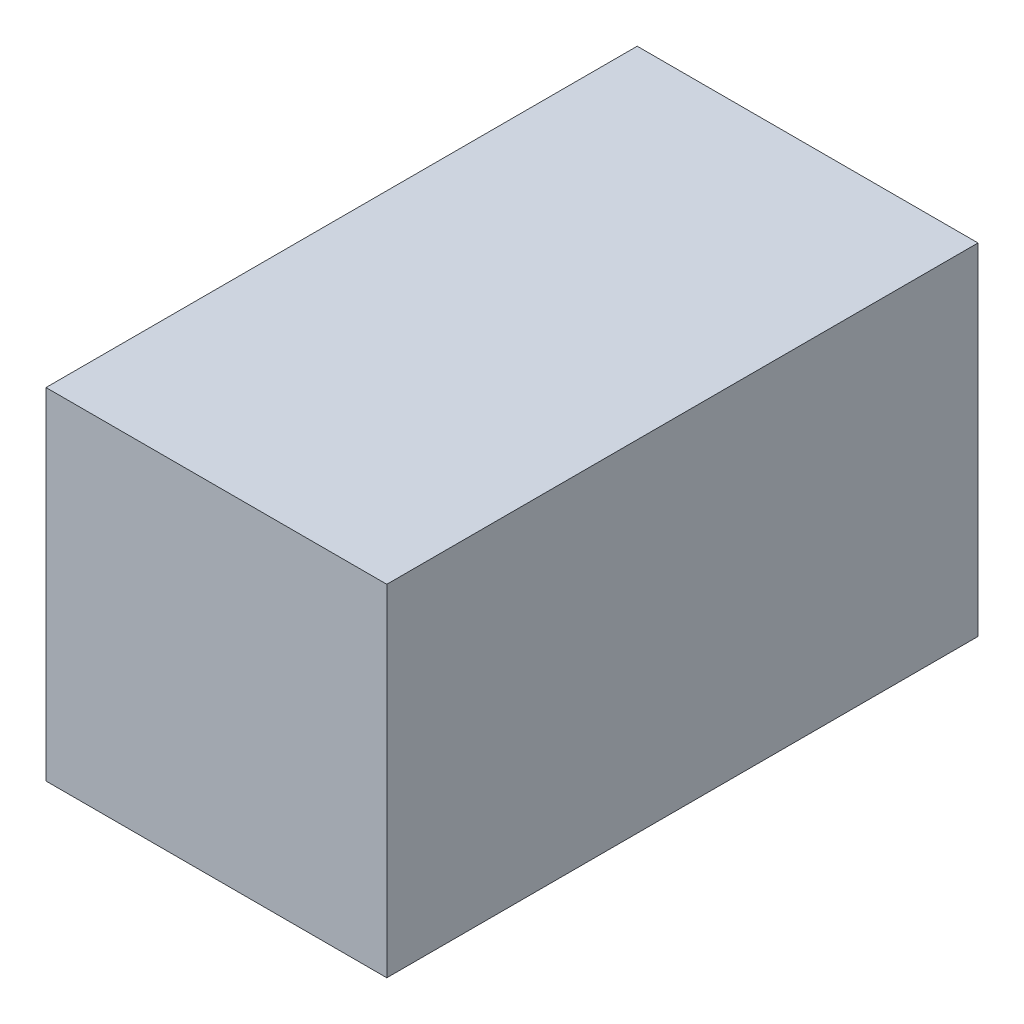
ISO-10303-21;
HEADER;
FILE_DESCRIPTION(('STEP AP214'),'2;1');
FILE_NAME('part.step','',(''),(''),'','','');
FILE_SCHEMA(('AUTOMOTIVE_DESIGN { 1 0 10303 214 1 1 1 1 }'));
ENDSEC;
DATA;
#1=APPLICATION_CONTEXT('core data for automotive mechanical design processes');
#2=APPLICATION_PROTOCOL_DEFINITION('international standard','automotive_design',2000,#1);
#3=PRODUCT_CONTEXT('',#1,'mechanical');
#4=PRODUCT('Part','Part','',(#3));
#5=PRODUCT_RELATED_PRODUCT_CATEGORY('part','',(#4));
#6=PRODUCT_DEFINITION_FORMATION('','',#4);
#7=PRODUCT_DEFINITION_CONTEXT('part definition',#1,'design');
#8=PRODUCT_DEFINITION('design','',#6,#7);
#9=PRODUCT_DEFINITION_SHAPE('','',#8);
#10=(LENGTH_UNIT() NAMED_UNIT(*) SI_UNIT(.MILLI.,.METRE.));
#11=(NAMED_UNIT(*) PLANE_ANGLE_UNIT() SI_UNIT($,.RADIAN.));
#12=(NAMED_UNIT(*) SI_UNIT($,.STERADIAN.) SOLID_ANGLE_UNIT());
#13=UNCERTAINTY_MEASURE_WITH_UNIT(LENGTH_MEASURE(1.E-05),#10,'distance_accuracy_value','');
#14=(GEOMETRIC_REPRESENTATION_CONTEXT(3) GLOBAL_UNCERTAINTY_ASSIGNED_CONTEXT((#13)) GLOBAL_UNIT_ASSIGNED_CONTEXT((#10,
#11,#12)) REPRESENTATION_CONTEXT('',''));
#15=CARTESIAN_POINT('',(0.,0.,0.));
#16=DIRECTION('',(0.,0.,1.));
#17=DIRECTION('',(1.,0.,0.));
#18=AXIS2_PLACEMENT_3D('',#15,#16,#17);
#19=CARTESIAN_POINT('',(-12.25,0.,0.));
#20=DIRECTION('',(0.,0.,1.));
#21=DIRECTION('',(1.,0.,0.));
#22=AXIS2_PLACEMENT_3D('',#19,#20,#21);
#23=PLANE('',#22);
#24=DIRECTION('',(1.,0.,0.));
#25=VECTOR('',#24,1.);
#26=CARTESIAN_POINT('',(-12.25,0.,0.));
#27=LINE('',#26,#25);
#28=CARTESIAN_POINT('',(-12.25,0.,0.));
#29=VERTEX_POINT('',#28);
#30=CARTESIAN_POINT('',(12.25,0.,0.));
#31=VERTEX_POINT('',#30);
#32=EDGE_CURVE('E39',#29,#31,#27,.T.);
#33=ORIENTED_EDGE('',*,*,#32,.T.);
#34=DIRECTION('',(0.,-1.,0.));
#35=VECTOR('',#34,1.);
#36=CARTESIAN_POINT('',(12.25,0.,0.));
#37=LINE('',#36,#35);
#38=CARTESIAN_POINT('',(12.25,24.5,0.));
#39=VERTEX_POINT('',#38);
#40=EDGE_CURVE('E76',#39,#31,#37,.T.);
#41=ORIENTED_EDGE('',*,*,#40,.F.);
#42=DIRECTION('',(1.,0.,0.));
#43=VECTOR('',#42,1.);
#44=CARTESIAN_POINT('',(-12.25,24.5,0.));
#45=LINE('',#44,#43);
#46=CARTESIAN_POINT('',(-12.25,24.5,0.));
#47=VERTEX_POINT('',#46);
#48=EDGE_CURVE('E11',#47,#39,#45,.T.);
#49=ORIENTED_EDGE('',*,*,#48,.F.);
#50=DIRECTION('',(0.,-1.,0.));
#51=VECTOR('',#50,1.);
#52=CARTESIAN_POINT('',(-12.25,0.,0.));
#53=LINE('',#52,#51);
#54=EDGE_CURVE('E77',#47,#29,#53,.T.);
#55=ORIENTED_EDGE('',*,*,#54,.T.);
#56=EDGE_LOOP('',(#33,#41,#49,#55));
#57=FACE_BOUND('',#56,.T.);
#58=ADVANCED_FACE('F36',(#57),#23,.T.);
#59=CARTESIAN_POINT('',(-12.25,24.5,0.));
#60=DIRECTION('',(0.,1.,0.));
#61=DIRECTION('',(0.,0.,1.));
#62=AXIS2_PLACEMENT_3D('',#59,#60,#61);
#63=PLANE('',#62);
#64=ORIENTED_EDGE('',*,*,#48,.T.);
#65=DIRECTION('',(0.,0.,1.));
#66=VECTOR('',#65,1.);
#67=CARTESIAN_POINT('',(12.25,24.5,0.));
#68=LINE('',#67,#66);
#69=CARTESIAN_POINT('',(12.25,24.5,-42.5));
#70=VERTEX_POINT('',#69);
#71=EDGE_CURVE('E93',#70,#39,#68,.T.);
#72=ORIENTED_EDGE('',*,*,#71,.F.);
#73=DIRECTION('',(1.,0.,0.));
#74=VECTOR('',#73,1.);
#75=CARTESIAN_POINT('',(-12.25,24.5,-42.5));
#76=LINE('',#75,#74);
#77=CARTESIAN_POINT('',(-12.25,24.5,-42.5));
#78=VERTEX_POINT('',#77);
#79=EDGE_CURVE('E44',#78,#70,#76,.T.);
#80=ORIENTED_EDGE('',*,*,#79,.F.);
#81=DIRECTION('',(0.,0.,1.));
#82=VECTOR('',#81,1.);
#83=CARTESIAN_POINT('',(-12.25,24.5,0.));
#84=LINE('',#83,#82);
#85=EDGE_CURVE('E82',#78,#47,#84,.T.);
#86=ORIENTED_EDGE('',*,*,#85,.T.);
#87=EDGE_LOOP('',(#64,#72,#80,#86));
#88=FACE_BOUND('',#87,.T.);
#89=ADVANCED_FACE('F108',(#88),#63,.T.);
#90=CARTESIAN_POINT('',(-12.25,0.,-42.5));
#91=DIRECTION('',(0.,0.,-1.));
#92=DIRECTION('',(-1.,0.,0.));
#93=AXIS2_PLACEMENT_3D('',#90,#91,#92);
#94=PLANE('',#93);
#95=ORIENTED_EDGE('',*,*,#79,.T.);
#96=DIRECTION('',(0.,1.,0.));
#97=VECTOR('',#96,1.);
#98=CARTESIAN_POINT('',(12.25,0.,-42.5));
#99=LINE('',#98,#97);
#100=CARTESIAN_POINT('',(12.25,0.,-42.5));
#101=VERTEX_POINT('',#100);
#102=EDGE_CURVE('E89',#101,#70,#99,.T.);
#103=ORIENTED_EDGE('',*,*,#102,.F.);
#104=DIRECTION('',(1.,0.,0.));
#105=VECTOR('',#104,1.);
#106=CARTESIAN_POINT('',(-12.25,0.,-42.5));
#107=LINE('',#106,#105);
#108=CARTESIAN_POINT('',(-12.25,0.,-42.5));
#109=VERTEX_POINT('',#108);
#110=EDGE_CURVE('E81',#109,#101,#107,.T.);
#111=ORIENTED_EDGE('',*,*,#110,.F.);
#112=DIRECTION('',(0.,1.,0.));
#113=VECTOR('',#112,1.);
#114=CARTESIAN_POINT('',(-12.25,0.,-42.5));
#115=LINE('',#114,#113);
#116=EDGE_CURVE('E101',#109,#78,#115,.T.);
#117=ORIENTED_EDGE('',*,*,#116,.T.);
#118=EDGE_LOOP('',(#95,#103,#111,#117));
#119=FACE_BOUND('',#118,.T.);
#120=ADVANCED_FACE('F105',(#119),#94,.T.);
#121=CARTESIAN_POINT('',(-12.25,0.,0.));
#122=DIRECTION('',(0.,-1.,0.));
#123=DIRECTION('',(0.,0.,-1.));
#124=AXIS2_PLACEMENT_3D('',#121,#122,#123);
#125=PLANE('',#124);
#126=ORIENTED_EDGE('',*,*,#110,.T.);
#127=DIRECTION('',(0.,0.,-1.));
#128=VECTOR('',#127,1.);
#129=CARTESIAN_POINT('',(12.25,0.,0.));
#130=LINE('',#129,#128);
#131=EDGE_CURVE('E84',#31,#101,#130,.T.);
#132=ORIENTED_EDGE('',*,*,#131,.F.);
#133=ORIENTED_EDGE('',*,*,#32,.F.);
#134=DIRECTION('',(0.,0.,-1.));
#135=VECTOR('',#134,1.);
#136=CARTESIAN_POINT('',(-12.25,0.,0.));
#137=LINE('',#136,#135);
#138=EDGE_CURVE('E99',#29,#109,#137,.T.);
#139=ORIENTED_EDGE('',*,*,#138,.T.);
#140=EDGE_LOOP('',(#126,#132,#133,#139));
#141=FACE_BOUND('',#140,.T.);
#142=ADVANCED_FACE('F85',(#141),#125,.T.);
#143=CARTESIAN_POINT('',(-12.25,0.,0.));
#144=DIRECTION('',(-1.,0.,0.));
#145=DIRECTION('',(0.,0.,1.));
#146=AXIS2_PLACEMENT_3D('',#143,#144,#145);
#147=PLANE('',#146);
#148=ORIENTED_EDGE('',*,*,#54,.F.);
#149=ORIENTED_EDGE('',*,*,#85,.F.);
#150=ORIENTED_EDGE('',*,*,#116,.F.);
#151=ORIENTED_EDGE('',*,*,#138,.F.);
#152=EDGE_LOOP('',(#148,#149,#150,#151));
#153=FACE_BOUND('',#152,.T.);
#154=ADVANCED_FACE('F110',(#153),#147,.T.);
#155=CARTESIAN_POINT('',(12.25,0.,0.));
#156=DIRECTION('',(-1.,0.,0.));
#157=DIRECTION('',(0.,0.,1.));
#158=AXIS2_PLACEMENT_3D('',#155,#156,#157);
#159=PLANE('',#158);
#160=ORIENTED_EDGE('',*,*,#40,.T.);
#161=ORIENTED_EDGE('',*,*,#131,.T.);
#162=ORIENTED_EDGE('',*,*,#102,.T.);
#163=ORIENTED_EDGE('',*,*,#71,.T.);
#164=EDGE_LOOP('',(#160,#161,#162,#163));
#165=FACE_BOUND('',#164,.T.);
#166=ADVANCED_FACE('F92',(#165),#159,.F.);
#167=CLOSED_SHELL('',(#58,#89,#120,#142,#154,#166));
#168=MANIFOLD_SOLID_BREP('B2',#167);
#169=ADVANCED_BREP_SHAPE_REPRESENTATION('',(#18,#168),#14);
#170=SHAPE_DEFINITION_REPRESENTATION(#9,#169);
ENDSEC;
END-ISO-10303-21;
